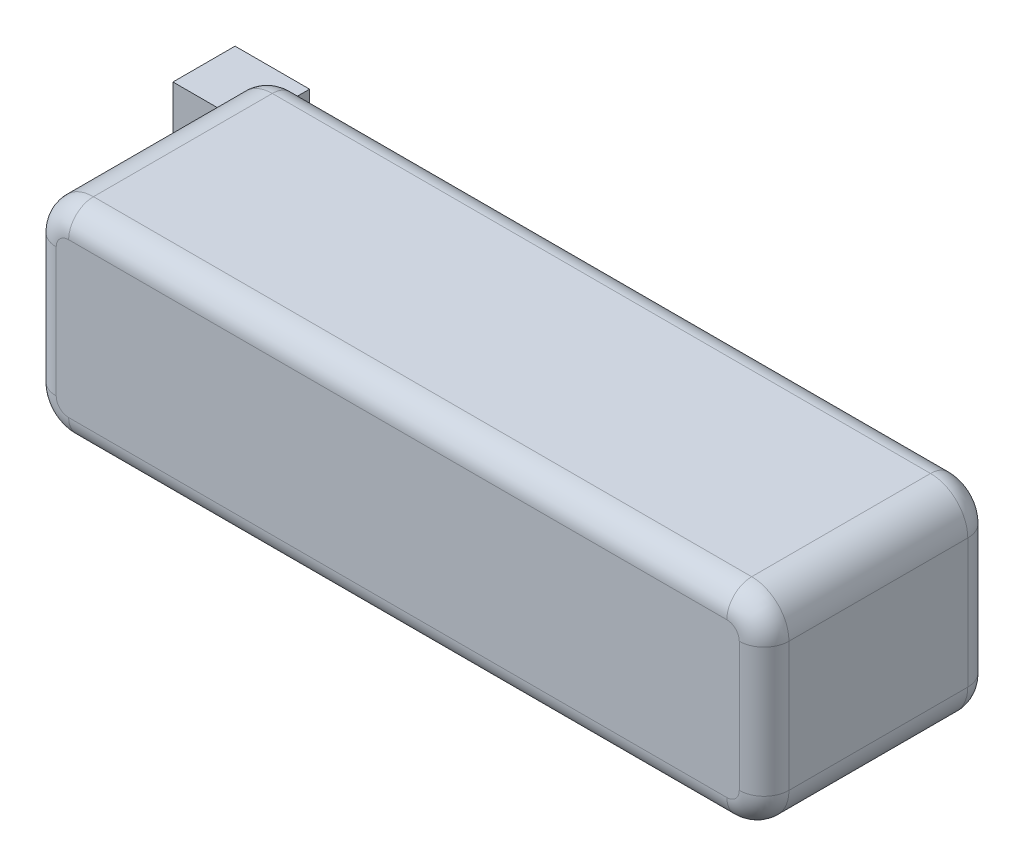
ISO-10303-21;
HEADER;
FILE_DESCRIPTION(('STEP AP214'),'2;1');
FILE_NAME('part.step','',(''),(''),'','','');
FILE_SCHEMA(('AUTOMOTIVE_DESIGN { 1 0 10303 214 1 1 1 1 }'));
ENDSEC;
DATA;
#1=APPLICATION_CONTEXT('core data for automotive mechanical design processes');
#2=APPLICATION_PROTOCOL_DEFINITION('international standard','automotive_design',2000,#1);
#3=PRODUCT_CONTEXT('',#1,'mechanical');
#4=PRODUCT('Part','Part','',(#3));
#5=PRODUCT_RELATED_PRODUCT_CATEGORY('part','',(#4));
#6=PRODUCT_DEFINITION_FORMATION('','',#4);
#7=PRODUCT_DEFINITION_CONTEXT('part definition',#1,'design');
#8=PRODUCT_DEFINITION('design','',#6,#7);
#9=PRODUCT_DEFINITION_SHAPE('','',#8);
#10=(LENGTH_UNIT() NAMED_UNIT(*) SI_UNIT(.MILLI.,.METRE.));
#11=(NAMED_UNIT(*) PLANE_ANGLE_UNIT() SI_UNIT($,.RADIAN.));
#12=(NAMED_UNIT(*) SI_UNIT($,.STERADIAN.) SOLID_ANGLE_UNIT());
#13=UNCERTAINTY_MEASURE_WITH_UNIT(LENGTH_MEASURE(1.E-05),#10,'distance_accuracy_value','');
#14=(GEOMETRIC_REPRESENTATION_CONTEXT(3) GLOBAL_UNCERTAINTY_ASSIGNED_CONTEXT((#13)) GLOBAL_UNIT_ASSIGNED_CONTEXT((#10,
#11,#12)) REPRESENTATION_CONTEXT('',''));
#15=CARTESIAN_POINT('',(0.,0.,0.));
#16=DIRECTION('',(0.,0.,1.));
#17=DIRECTION('',(1.,0.,0.));
#18=AXIS2_PLACEMENT_3D('',#15,#16,#17);
#19=CARTESIAN_POINT('',(0.,20.828,0.));
#20=DIRECTION('',(1.,0.,0.));
#21=DIRECTION('',(0.,0.,-1.));
#22=AXIS2_PLACEMENT_3D('',#19,#20,#21);
#23=PLANE('',#22);
#24=DIRECTION('',(0.,0.,1.));
#25=VECTOR('',#24,1.);
#26=CARTESIAN_POINT('',(0.,17.018,0.));
#27=LINE('',#26,#25);
#28=CARTESIAN_POINT('',(0.,17.018,20.828));
#29=VERTEX_POINT('',#28);
#30=CARTESIAN_POINT('',(0.,17.018,2.54));
#31=VERTEX_POINT('',#30);
#32=EDGE_CURVE('E266',#29,#31,#27,.F.);
#33=ORIENTED_EDGE('',*,*,#32,.T.);
#34=DIRECTION('',(0.,-1.,0.));
#35=VECTOR('',#34,1.);
#36=CARTESIAN_POINT('',(0.,20.828,2.54));
#37=LINE('',#36,#35);
#38=CARTESIAN_POINT('',(0.,15.494,2.54));
#39=VERTEX_POINT('',#38);
#40=EDGE_CURVE('E340',#31,#39,#37,.T.);
#41=ORIENTED_EDGE('',*,*,#40,.T.);
#42=DIRECTION('',(0.,0.,-1.));
#43=VECTOR('',#42,1.);
#44=CARTESIAN_POINT('',(0.,15.494,0.));
#45=LINE('',#44,#43);
#46=CARTESIAN_POINT('',(0.,15.494,3.81));
#47=VERTEX_POINT('',#46);
#48=EDGE_CURVE('E806',#47,#39,#45,.T.);
#49=ORIENTED_EDGE('',*,*,#48,.F.);
#50=DIRECTION('',(0.,-1.,0.));
#51=VECTOR('',#50,1.);
#52=CARTESIAN_POINT('',(0.,20.828,3.81));
#53=LINE('',#52,#51);
#54=CARTESIAN_POINT('',(0.,5.334,3.81));
#55=VERTEX_POINT('',#54);
#56=EDGE_CURVE('E233',#47,#55,#53,.T.);
#57=ORIENTED_EDGE('',*,*,#56,.T.);
#58=DIRECTION('',(0.,0.,-1.));
#59=VECTOR('',#58,1.);
#60=CARTESIAN_POINT('',(0.,5.334,0.));
#61=LINE('',#60,#59);
#62=CARTESIAN_POINT('',(0.,5.334,2.54));
#63=VERTEX_POINT('',#62);
#64=EDGE_CURVE('E226',#55,#63,#61,.T.);
#65=ORIENTED_EDGE('',*,*,#64,.T.);
#66=DIRECTION('',(0.,-1.,0.));
#67=VECTOR('',#66,1.);
#68=CARTESIAN_POINT('',(0.,20.828,2.54));
#69=LINE('',#68,#67);
#70=CARTESIAN_POINT('',(0.,3.81,2.54));
#71=VERTEX_POINT('',#70);
#72=EDGE_CURVE('E315',#63,#71,#69,.T.);
#73=ORIENTED_EDGE('',*,*,#72,.T.);
#74=DIRECTION('',(0.,0.,1.));
#75=VECTOR('',#74,1.);
#76=CARTESIAN_POINT('',(0.,3.81,0.));
#77=LINE('',#76,#75);
#78=CARTESIAN_POINT('',(0.,3.81,20.828));
#79=VERTEX_POINT('',#78);
#80=EDGE_CURVE('E264',#71,#79,#77,.T.);
#81=ORIENTED_EDGE('',*,*,#80,.T.);
#82=DIRECTION('',(0.,-1.,0.));
#83=VECTOR('',#82,1.);
#84=CARTESIAN_POINT('',(0.,20.828,20.828));
#85=LINE('',#84,#83);
#86=EDGE_CURVE('E298',#79,#29,#85,.F.);
#87=ORIENTED_EDGE('',*,*,#86,.T.);
#88=EDGE_LOOP('',(#33,#41,#49,#57,#65,#73,#81,#87));
#89=FACE_BOUND('',#88,.T.);
#90=ADVANCED_FACE('F41',(#89),#23,.F.);
#91=CARTESIAN_POINT('',(0.,20.828,23.368));
#92=DIRECTION('',(0.,0.,-1.));
#93=DIRECTION('',(-1.,0.,0.));
#94=AXIS2_PLACEMENT_3D('',#91,#92,#93);
#95=PLANE('',#94);
#96=DIRECTION('',(0.,-1.,0.));
#97=VECTOR('',#96,1.);
#98=CARTESIAN_POINT('',(2.54000000000001,20.828,23.368));
#99=LINE('',#98,#97);
#100=CARTESIAN_POINT('',(2.54000000000001,17.018,23.368));
#101=VERTEX_POINT('',#100);
#102=CARTESIAN_POINT('',(2.54000000000001,3.81,23.368));
#103=VERTEX_POINT('',#102);
#104=EDGE_CURVE('E290',#101,#103,#99,.T.);
#105=ORIENTED_EDGE('',*,*,#104,.T.);
#106=CARTESIAN_POINT('',(3.81000000000001,3.81,23.368));
#107=DIRECTION('',(0.,0.,-1.));
#108=DIRECTION('',(-1.,0.,0.));
#109=AXIS2_PLACEMENT_3D('',#106,#107,#108);
#110=CIRCLE('',#109,1.27);
#111=CARTESIAN_POINT('',(3.81000000000001,2.54,23.368));
#112=VERTEX_POINT('',#111);
#113=EDGE_CURVE('E292',#103,#112,#110,.F.);
#114=ORIENTED_EDGE('',*,*,#113,.T.);
#115=DIRECTION('',(1.,0.,0.));
#116=VECTOR('',#115,1.);
#117=CARTESIAN_POINT('',(0.,2.54,23.368));
#118=LINE('',#117,#116);
#119=CARTESIAN_POINT('',(71.12,2.54,23.368));
#120=VERTEX_POINT('',#119);
#121=EDGE_CURVE('E278',#112,#120,#118,.T.);
#122=ORIENTED_EDGE('',*,*,#121,.T.);
#123=CARTESIAN_POINT('',(71.12,3.81,23.368));
#124=DIRECTION('',(0.,0.,-1.));
#125=DIRECTION('',(-1.,0.,0.));
#126=AXIS2_PLACEMENT_3D('',#123,#124,#125);
#127=CIRCLE('',#126,1.27);
#128=CARTESIAN_POINT('',(72.39,3.81,23.368));
#129=VERTEX_POINT('',#128);
#130=EDGE_CURVE('E280',#120,#129,#127,.F.);
#131=ORIENTED_EDGE('',*,*,#130,.T.);
#132=DIRECTION('',(0.,-1.,0.));
#133=VECTOR('',#132,1.);
#134=CARTESIAN_POINT('',(72.39,20.828,23.368));
#135=LINE('',#134,#133);
#136=CARTESIAN_POINT('',(72.39,17.018,23.368));
#137=VERTEX_POINT('',#136);
#138=EDGE_CURVE('E282',#129,#137,#135,.F.);
#139=ORIENTED_EDGE('',*,*,#138,.T.);
#140=CARTESIAN_POINT('',(71.12,17.018,23.368));
#141=DIRECTION('',(0.,0.,-1.));
#142=DIRECTION('',(-1.,0.,0.));
#143=AXIS2_PLACEMENT_3D('',#140,#141,#142);
#144=CIRCLE('',#143,1.27);
#145=CARTESIAN_POINT('',(71.12,18.288,23.368));
#146=VERTEX_POINT('',#145);
#147=EDGE_CURVE('E284',#137,#146,#144,.F.);
#148=ORIENTED_EDGE('',*,*,#147,.T.);
#149=DIRECTION('',(1.,0.,0.));
#150=VECTOR('',#149,1.);
#151=CARTESIAN_POINT('',(3.81000000000001,18.288,23.368));
#152=LINE('',#151,#150);
#153=CARTESIAN_POINT('',(3.81000000000001,18.288,23.368));
#154=VERTEX_POINT('',#153);
#155=EDGE_CURVE('E286',#146,#154,#152,.F.);
#156=ORIENTED_EDGE('',*,*,#155,.T.);
#157=CARTESIAN_POINT('',(3.81000000000001,17.018,23.368));
#158=DIRECTION('',(0.,0.,-1.));
#159=DIRECTION('',(-1.,0.,0.));
#160=AXIS2_PLACEMENT_3D('',#157,#158,#159);
#161=CIRCLE('',#160,1.27);
#162=EDGE_CURVE('E288',#154,#101,#161,.F.);
#163=ORIENTED_EDGE('',*,*,#162,.T.);
#164=EDGE_LOOP('',(#105,#114,#122,#131,#139,#148,#156,#163));
#165=FACE_BOUND('',#164,.T.);
#166=ADVANCED_FACE('F456',(#165),#95,.F.);
#167=CARTESIAN_POINT('',(74.93,20.828,0.));
#168=DIRECTION('',(-1.,0.,0.));
#169=DIRECTION('',(0.,0.,1.));
#170=AXIS2_PLACEMENT_3D('',#167,#168,#169);
#171=PLANE('',#170);
#172=DIRECTION('',(0.,0.,-1.));
#173=VECTOR('',#172,1.);
#174=CARTESIAN_POINT('',(74.93,3.81,0.));
#175=LINE('',#174,#173);
#176=CARTESIAN_POINT('',(74.93,3.81,20.828));
#177=VERTEX_POINT('',#176);
#178=CARTESIAN_POINT('',(74.93,3.81,2.54));
#179=VERTEX_POINT('',#178);
#180=EDGE_CURVE('E269',#177,#179,#175,.T.);
#181=ORIENTED_EDGE('',*,*,#180,.T.);
#182=DIRECTION('',(0.,-1.,0.));
#183=VECTOR('',#182,1.);
#184=CARTESIAN_POINT('',(74.93,20.828,2.54));
#185=LINE('',#184,#183);
#186=CARTESIAN_POINT('',(74.93,17.018,2.54));
#187=VERTEX_POINT('',#186);
#188=EDGE_CURVE('E367',#179,#187,#185,.F.);
#189=ORIENTED_EDGE('',*,*,#188,.T.);
#190=DIRECTION('',(0.,0.,-1.));
#191=VECTOR('',#190,1.);
#192=CARTESIAN_POINT('',(74.93,17.018,23.368));
#193=LINE('',#192,#191);
#194=CARTESIAN_POINT('',(74.93,17.018,20.828));
#195=VERTEX_POINT('',#194);
#196=EDGE_CURVE('E272',#187,#195,#193,.F.);
#197=ORIENTED_EDGE('',*,*,#196,.T.);
#198=DIRECTION('',(0.,-1.,0.));
#199=VECTOR('',#198,1.);
#200=CARTESIAN_POINT('',(74.93,20.828,20.828));
#201=LINE('',#200,#199);
#202=EDGE_CURVE('E308',#195,#177,#201,.T.);
#203=ORIENTED_EDGE('',*,*,#202,.T.);
#204=EDGE_LOOP('',(#181,#189,#197,#203));
#205=FACE_BOUND('',#204,.T.);
#206=ADVANCED_FACE('F462',(#205),#171,.F.);
#207=CARTESIAN_POINT('',(0.,20.828,0.));
#208=DIRECTION('',(0.,0.,1.));
#209=DIRECTION('',(1.,0.,0.));
#210=AXIS2_PLACEMENT_3D('',#207,#208,#209);
#211=PLANE('',#210);
#212=DIRECTION('',(0.,-1.,0.));
#213=VECTOR('',#212,1.);
#214=CARTESIAN_POINT('',(2.54,15.494,0.));
#215=LINE('',#214,#213);
#216=CARTESIAN_POINT('',(2.54,5.334,0.));
#217=VERTEX_POINT('',#216);
#218=CARTESIAN_POINT('',(2.54,15.494,0.));
#219=VERTEX_POINT('',#218);
#220=EDGE_CURVE('E246',#217,#219,#215,.F.);
#221=ORIENTED_EDGE('',*,*,#220,.T.);
#222=DIRECTION('',(0.,-1.,0.));
#223=VECTOR('',#222,1.);
#224=CARTESIAN_POINT('',(2.54,20.828,0.));
#225=LINE('',#224,#223);
#226=CARTESIAN_POINT('',(2.54,17.018,0.));
#227=VERTEX_POINT('',#226);
#228=EDGE_CURVE('E359',#219,#227,#225,.F.);
#229=ORIENTED_EDGE('',*,*,#228,.T.);
#230=CARTESIAN_POINT('',(3.81,17.018,0.));
#231=DIRECTION('',(0.,0.,1.));
#232=DIRECTION('',(1.,0.,0.));
#233=AXIS2_PLACEMENT_3D('',#230,#231,#232);
#234=CIRCLE('',#233,1.27);
#235=CARTESIAN_POINT('',(3.81,18.288,0.));
#236=VERTEX_POINT('',#235);
#237=EDGE_CURVE('E357',#227,#236,#234,.F.);
#238=ORIENTED_EDGE('',*,*,#237,.T.);
#239=DIRECTION('',(-1.,0.,0.));
#240=VECTOR('',#239,1.);
#241=CARTESIAN_POINT('',(71.12,18.288,0.));
#242=LINE('',#241,#240);
#243=CARTESIAN_POINT('',(71.12,18.288,0.));
#244=VERTEX_POINT('',#243);
#245=EDGE_CURVE('E355',#236,#244,#242,.F.);
#246=ORIENTED_EDGE('',*,*,#245,.T.);
#247=CARTESIAN_POINT('',(71.12,17.018,0.));
#248=DIRECTION('',(0.,0.,1.));
#249=DIRECTION('',(1.,0.,0.));
#250=AXIS2_PLACEMENT_3D('',#247,#248,#249);
#251=CIRCLE('',#250,1.27);
#252=CARTESIAN_POINT('',(72.39,17.018,0.));
#253=VERTEX_POINT('',#252);
#254=EDGE_CURVE('E353',#244,#253,#251,.F.);
#255=ORIENTED_EDGE('',*,*,#254,.T.);
#256=DIRECTION('',(0.,-1.,0.));
#257=VECTOR('',#256,1.);
#258=CARTESIAN_POINT('',(72.39,20.828,0.));
#259=LINE('',#258,#257);
#260=CARTESIAN_POINT('',(72.39,3.81,0.));
#261=VERTEX_POINT('',#260);
#262=EDGE_CURVE('E351',#253,#261,#259,.T.);
#263=ORIENTED_EDGE('',*,*,#262,.T.);
#264=CARTESIAN_POINT('',(71.12,3.81,0.));
#265=DIRECTION('',(0.,0.,1.));
#266=DIRECTION('',(1.,0.,0.));
#267=AXIS2_PLACEMENT_3D('',#264,#265,#266);
#268=CIRCLE('',#267,1.27);
#269=CARTESIAN_POINT('',(71.12,2.54,0.));
#270=VERTEX_POINT('',#269);
#271=EDGE_CURVE('E349',#261,#270,#268,.F.);
#272=ORIENTED_EDGE('',*,*,#271,.T.);
#273=DIRECTION('',(-1.,0.,0.));
#274=VECTOR('',#273,1.);
#275=CARTESIAN_POINT('',(0.,2.54,0.));
#276=LINE('',#275,#274);
#277=CARTESIAN_POINT('',(3.81,2.54,0.));
#278=VERTEX_POINT('',#277);
#279=EDGE_CURVE('E343',#270,#278,#276,.T.);
#280=ORIENTED_EDGE('',*,*,#279,.T.);
#281=CARTESIAN_POINT('',(3.81,3.81,0.));
#282=DIRECTION('',(0.,0.,1.));
#283=DIRECTION('',(1.,0.,0.));
#284=AXIS2_PLACEMENT_3D('',#281,#282,#283);
#285=CIRCLE('',#284,1.27);
#286=CARTESIAN_POINT('',(2.54,3.81,0.));
#287=VERTEX_POINT('',#286);
#288=EDGE_CURVE('E345',#278,#287,#285,.F.);
#289=ORIENTED_EDGE('',*,*,#288,.T.);
#290=DIRECTION('',(0.,-1.,0.));
#291=VECTOR('',#290,1.);
#292=CARTESIAN_POINT('',(2.54,20.828,0.));
#293=LINE('',#292,#291);
#294=EDGE_CURVE('E347',#287,#217,#293,.F.);
#295=ORIENTED_EDGE('',*,*,#294,.T.);
#296=EDGE_LOOP('',(#221,#229,#238,#246,#255,#263,#272,#280,#289,#295));
#297=FACE_BOUND('',#296,.T.);
#298=ADVANCED_FACE('F406',(#297),#211,.F.);
#299=CARTESIAN_POINT('',(0.,20.828,23.368));
#300=DIRECTION('',(0.,1.,0.));
#301=DIRECTION('',(0.,0.,1.));
#302=AXIS2_PLACEMENT_3D('',#299,#300,#301);
#303=PLANE('',#302);
#304=DIRECTION('',(0.,0.,-1.));
#305=VECTOR('',#304,1.);
#306=CARTESIAN_POINT('',(71.12,20.828,0.));
#307=LINE('',#306,#305);
#308=CARTESIAN_POINT('',(71.12,20.828,20.828));
#309=VERTEX_POINT('',#308);
#310=CARTESIAN_POINT('',(71.12,20.828,2.54));
#311=VERTEX_POINT('',#310);
#312=EDGE_CURVE('E259',#309,#311,#307,.T.);
#313=ORIENTED_EDGE('',*,*,#312,.T.);
#314=DIRECTION('',(-1.,0.,0.));
#315=VECTOR('',#314,1.);
#316=CARTESIAN_POINT('',(3.81,20.828,2.54));
#317=LINE('',#316,#315);
#318=CARTESIAN_POINT('',(3.81,20.828,2.54));
#319=VERTEX_POINT('',#318);
#320=EDGE_CURVE('E363',#311,#319,#317,.T.);
#321=ORIENTED_EDGE('',*,*,#320,.T.);
#322=DIRECTION('',(0.,0.,1.));
#323=VECTOR('',#322,1.);
#324=CARTESIAN_POINT('',(3.81000000000001,20.828,23.368));
#325=LINE('',#324,#323);
#326=CARTESIAN_POINT('',(3.81000000000001,20.828,20.828));
#327=VERTEX_POINT('',#326);
#328=EDGE_CURVE('E262',#319,#327,#325,.T.);
#329=ORIENTED_EDGE('',*,*,#328,.T.);
#330=DIRECTION('',(1.,0.,0.));
#331=VECTOR('',#330,1.);
#332=CARTESIAN_POINT('',(71.12,20.828,20.828));
#333=LINE('',#332,#331);
#334=EDGE_CURVE('E303',#327,#309,#333,.T.);
#335=ORIENTED_EDGE('',*,*,#334,.T.);
#336=EDGE_LOOP('',(#313,#321,#329,#335));
#337=FACE_BOUND('',#336,.T.);
#338=ADVANCED_FACE('F726',(#337),#303,.T.);
#339=CARTESIAN_POINT('',(0.,0.,23.368));
#340=DIRECTION('',(0.,1.,0.));
#341=DIRECTION('',(0.,0.,1.));
#342=AXIS2_PLACEMENT_3D('',#339,#340,#341);
#343=PLANE('',#342);
#344=DIRECTION('',(0.,0.,1.));
#345=VECTOR('',#344,1.);
#346=CARTESIAN_POINT('',(3.81000000000001,0.,23.368));
#347=LINE('',#346,#345);
#348=CARTESIAN_POINT('',(3.81000000000001,0.,20.828));
#349=VERTEX_POINT('',#348);
#350=CARTESIAN_POINT('',(3.81,0.,2.54));
#351=VERTEX_POINT('',#350);
#352=EDGE_CURVE('E274',#349,#351,#347,.F.);
#353=ORIENTED_EDGE('',*,*,#352,.T.);
#354=DIRECTION('',(-1.,0.,0.));
#355=VECTOR('',#354,1.);
#356=CARTESIAN_POINT('',(0.,0.,2.54));
#357=LINE('',#356,#355);
#358=CARTESIAN_POINT('',(71.12,0.,2.54));
#359=VERTEX_POINT('',#358);
#360=EDGE_CURVE('E65',#351,#359,#357,.F.);
#361=ORIENTED_EDGE('',*,*,#360,.T.);
#362=DIRECTION('',(0.,0.,-1.));
#363=VECTOR('',#362,1.);
#364=CARTESIAN_POINT('',(71.12,0.,23.368));
#365=LINE('',#364,#363);
#366=CARTESIAN_POINT('',(71.12,0.,20.828));
#367=VERTEX_POINT('',#366);
#368=EDGE_CURVE('E276',#359,#367,#365,.F.);
#369=ORIENTED_EDGE('',*,*,#368,.T.);
#370=DIRECTION('',(1.,0.,0.));
#371=VECTOR('',#370,1.);
#372=CARTESIAN_POINT('',(0.,0.,20.828));
#373=LINE('',#372,#371);
#374=EDGE_CURVE('E313',#367,#349,#373,.F.);
#375=ORIENTED_EDGE('',*,*,#374,.T.);
#376=EDGE_LOOP('',(#353,#361,#369,#375));
#377=FACE_BOUND('',#376,.T.);
#378=ADVANCED_FACE('F692',(#377),#343,.F.);
#379=CARTESIAN_POINT('',(0.,0.,0.));
#380=DIRECTION('',(-1.,0.,0.));
#381=DIRECTION('',(0.,0.,1.));
#382=AXIS2_PLACEMENT_3D('',#379,#380,#381);
#383=PLANE('',#382);
#384=CARTESIAN_POINT('',(0.,15.494,-2.54));
#385=VERTEX_POINT('',#384);
#386=CARTESIAN_POINT('',(0.,15.494,-5.08));
#387=VERTEX_POINT('',#386);
#388=EDGE_CURVE('E231',#385,#387,#45,.T.);
#389=ORIENTED_EDGE('',*,*,#388,.F.);
#390=DIRECTION('',(0.,-1.,0.));
#391=VECTOR('',#390,1.);
#392=CARTESIAN_POINT('',(0.,5.334,-2.54));
#393=LINE('',#392,#391);
#394=CARTESIAN_POINT('',(0.,5.334,-2.54));
#395=VERTEX_POINT('',#394);
#396=EDGE_CURVE('E243',#385,#395,#393,.T.);
#397=ORIENTED_EDGE('',*,*,#396,.T.);
#398=CARTESIAN_POINT('',(0.,5.334,-5.08));
#399=VERTEX_POINT('',#398);
#400=EDGE_CURVE('E413',#395,#399,#61,.T.);
#401=ORIENTED_EDGE('',*,*,#400,.T.);
#402=DIRECTION('',(0.,-1.,0.));
#403=VECTOR('',#402,1.);
#404=CARTESIAN_POINT('',(0.,0.,-5.08));
#405=LINE('',#404,#403);
#406=EDGE_CURVE('E798',#387,#399,#405,.T.);
#407=ORIENTED_EDGE('',*,*,#406,.F.);
#408=EDGE_LOOP('',(#389,#397,#401,#407));
#409=FACE_BOUND('',#408,.T.);
#410=ADVANCED_FACE('F688',(#409),#383,.F.);
#411=CARTESIAN_POINT('',(-7.62,15.494,0.));
#412=DIRECTION('',(0.,-1.,0.));
#413=DIRECTION('',(0.,0.,-1.));
#414=AXIS2_PLACEMENT_3D('',#411,#412,#413);
#415=PLANE('',#414);
#416=ORIENTED_EDGE('',*,*,#48,.T.);
#417=CARTESIAN_POINT('',(2.54,15.494,2.54));
#418=DIRECTION('',(0.,-1.,0.));
#419=DIRECTION('',(0.,0.,-1.));
#420=AXIS2_PLACEMENT_3D('',#417,#418,#419);
#421=CIRCLE('',#420,2.54);
#422=EDGE_CURVE('E50',#39,#219,#421,.T.);
#423=ORIENTED_EDGE('',*,*,#422,.T.);
#424=CARTESIAN_POINT('',(2.54,15.494,-2.54));
#425=DIRECTION('',(0.,-1.,0.));
#426=DIRECTION('',(0.,0.,-1.));
#427=AXIS2_PLACEMENT_3D('',#424,#425,#426);
#428=CIRCLE('',#427,2.54);
#429=EDGE_CURVE('E257',#219,#385,#428,.T.);
#430=ORIENTED_EDGE('',*,*,#429,.T.);
#431=ORIENTED_EDGE('',*,*,#388,.T.);
#432=DIRECTION('',(1.,0.,0.));
#433=VECTOR('',#432,1.);
#434=CARTESIAN_POINT('',(-7.62,15.494,-5.08));
#435=LINE('',#434,#433);
#436=CARTESIAN_POINT('',(-7.62,15.494,-5.08));
#437=VERTEX_POINT('',#436);
#438=EDGE_CURVE('E210',#437,#387,#435,.T.);
#439=ORIENTED_EDGE('',*,*,#438,.F.);
#440=DIRECTION('',(0.,0.,-1.));
#441=VECTOR('',#440,1.);
#442=CARTESIAN_POINT('',(-7.62,15.494,0.));
#443=LINE('',#442,#441);
#444=CARTESIAN_POINT('',(-7.62,15.494,1.27));
#445=VERTEX_POINT('',#444);
#446=EDGE_CURVE('E217',#445,#437,#443,.T.);
#447=ORIENTED_EDGE('',*,*,#446,.F.);
#448=DIRECTION('',(1.,0.,0.));
#449=VECTOR('',#448,1.);
#450=CARTESIAN_POINT('',(-7.62,15.494,1.27));
#451=LINE('',#450,#449);
#452=CARTESIAN_POINT('',(-2.54,15.494,1.27));
#453=VERTEX_POINT('',#452);
#454=EDGE_CURVE('E802',#445,#453,#451,.T.);
#455=ORIENTED_EDGE('',*,*,#454,.T.);
#456=CARTESIAN_POINT('',(-2.54,15.494,3.81));
#457=DIRECTION('',(0.,-1.,0.));
#458=DIRECTION('',(0.,0.,-1.));
#459=AXIS2_PLACEMENT_3D('',#456,#457,#458);
#460=CIRCLE('',#459,2.54);
#461=EDGE_CURVE('E251',#453,#47,#460,.T.);
#462=ORIENTED_EDGE('',*,*,#461,.T.);
#463=EDGE_LOOP('',(#416,#423,#430,#431,#439,#447,#455,#462));
#464=FACE_BOUND('',#463,.T.);
#465=ADVANCED_FACE('F229',(#464),#415,.F.);
#466=CARTESIAN_POINT('',(-7.62,0.,-5.07999999999999));
#467=DIRECTION('',(0.,0.,1.));
#468=DIRECTION('',(1.,0.,0.));
#469=AXIS2_PLACEMENT_3D('',#466,#467,#468);
#470=PLANE('',#469);
#471=ORIENTED_EDGE('',*,*,#406,.T.);
#472=DIRECTION('',(1.,0.,0.));
#473=VECTOR('',#472,1.);
#474=CARTESIAN_POINT('',(-7.62,5.334,-5.07999999999999));
#475=LINE('',#474,#473);
#476=CARTESIAN_POINT('',(-7.62,5.334,-5.07999999999999));
#477=VERTEX_POINT('',#476);
#478=EDGE_CURVE('E212',#477,#399,#475,.T.);
#479=ORIENTED_EDGE('',*,*,#478,.F.);
#480=DIRECTION('',(0.,-1.,0.));
#481=VECTOR('',#480,1.);
#482=CARTESIAN_POINT('',(-7.62,0.,-5.07999999999999));
#483=LINE('',#482,#481);
#484=EDGE_CURVE('E205',#437,#477,#483,.T.);
#485=ORIENTED_EDGE('',*,*,#484,.F.);
#486=ORIENTED_EDGE('',*,*,#438,.T.);
#487=EDGE_LOOP('',(#471,#479,#485,#486));
#488=FACE_BOUND('',#487,.T.);
#489=ADVANCED_FACE('F208',(#488),#470,.F.);
#490=CARTESIAN_POINT('',(-7.62,5.334,0.));
#491=DIRECTION('',(0.,-1.,0.));
#492=DIRECTION('',(0.,0.,-1.));
#493=AXIS2_PLACEMENT_3D('',#490,#491,#492);
#494=PLANE('',#493);
#495=ORIENTED_EDGE('',*,*,#64,.F.);
#496=CARTESIAN_POINT('',(-2.54,5.334,3.81));
#497=DIRECTION('',(0.,-1.,0.));
#498=DIRECTION('',(0.,0.,-1.));
#499=AXIS2_PLACEMENT_3D('',#496,#497,#498);
#500=CIRCLE('',#499,2.54);
#501=CARTESIAN_POINT('',(-2.54,5.334,1.27));
#502=VERTEX_POINT('',#501);
#503=EDGE_CURVE('E249',#55,#502,#500,.F.);
#504=ORIENTED_EDGE('',*,*,#503,.T.);
#505=DIRECTION('',(1.,0.,0.));
#506=VECTOR('',#505,1.);
#507=CARTESIAN_POINT('',(-7.62,5.334,1.27000000000001));
#508=LINE('',#507,#506);
#509=CARTESIAN_POINT('',(-7.62,5.334,1.27000000000001));
#510=VERTEX_POINT('',#509);
#511=EDGE_CURVE('E238',#510,#502,#508,.T.);
#512=ORIENTED_EDGE('',*,*,#511,.F.);
#513=DIRECTION('',(0.,0.,-1.));
#514=VECTOR('',#513,1.);
#515=CARTESIAN_POINT('',(-7.62,5.334,0.));
#516=LINE('',#515,#514);
#517=EDGE_CURVE('E216',#510,#477,#516,.T.);
#518=ORIENTED_EDGE('',*,*,#517,.T.);
#519=ORIENTED_EDGE('',*,*,#478,.T.);
#520=ORIENTED_EDGE('',*,*,#400,.F.);
#521=CARTESIAN_POINT('',(2.54,5.334,-2.54));
#522=DIRECTION('',(0.,-1.,0.));
#523=DIRECTION('',(0.,0.,-1.));
#524=AXIS2_PLACEMENT_3D('',#521,#522,#523);
#525=CIRCLE('',#524,2.54);
#526=EDGE_CURVE('E254',#395,#217,#525,.F.);
#527=ORIENTED_EDGE('',*,*,#526,.T.);
#528=CARTESIAN_POINT('',(2.54,5.334,2.54));
#529=DIRECTION('',(0.,-1.,0.));
#530=DIRECTION('',(0.,0.,-1.));
#531=AXIS2_PLACEMENT_3D('',#528,#529,#530);
#532=CIRCLE('',#531,2.54);
#533=EDGE_CURVE('E11',#217,#63,#532,.F.);
#534=ORIENTED_EDGE('',*,*,#533,.T.);
#535=EDGE_LOOP('',(#495,#504,#512,#518,#519,#520,#527,#534));
#536=FACE_BOUND('',#535,.T.);
#537=ADVANCED_FACE('F411',(#536),#494,.T.);
#538=CARTESIAN_POINT('',(-7.62,0.,1.27000000000001));
#539=DIRECTION('',(0.,0.,1.));
#540=DIRECTION('',(1.,0.,0.));
#541=AXIS2_PLACEMENT_3D('',#538,#539,#540);
#542=PLANE('',#541);
#543=ORIENTED_EDGE('',*,*,#511,.T.);
#544=DIRECTION('',(0.,-1.,0.));
#545=VECTOR('',#544,1.);
#546=CARTESIAN_POINT('',(-2.54,0.,1.27));
#547=LINE('',#546,#545);
#548=EDGE_CURVE('E236',#502,#453,#547,.F.);
#549=ORIENTED_EDGE('',*,*,#548,.T.);
#550=ORIENTED_EDGE('',*,*,#454,.F.);
#551=DIRECTION('',(0.,-1.,0.));
#552=VECTOR('',#551,1.);
#553=CARTESIAN_POINT('',(-7.62,0.,1.27000000000001));
#554=LINE('',#553,#552);
#555=EDGE_CURVE('E223',#445,#510,#554,.T.);
#556=ORIENTED_EDGE('',*,*,#555,.T.);
#557=EDGE_LOOP('',(#543,#549,#550,#556));
#558=FACE_BOUND('',#557,.T.);
#559=ADVANCED_FACE('F675',(#558),#542,.T.);
#560=CARTESIAN_POINT('',(-7.62,0.,0.));
#561=DIRECTION('',(-1.,0.,0.));
#562=DIRECTION('',(0.,0.,1.));
#563=AXIS2_PLACEMENT_3D('',#560,#561,#562);
#564=PLANE('',#563);
#565=ORIENTED_EDGE('',*,*,#446,.T.);
#566=ORIENTED_EDGE('',*,*,#484,.T.);
#567=ORIENTED_EDGE('',*,*,#517,.F.);
#568=ORIENTED_EDGE('',*,*,#555,.F.);
#569=EDGE_LOOP('',(#565,#566,#567,#568));
#570=FACE_BOUND('',#569,.T.);
#571=ADVANCED_FACE('F221',(#570),#564,.T.);
#572=CARTESIAN_POINT('',(-2.54,20.828,3.81));
#573=DIRECTION('',(0.,-1.,0.));
#574=DIRECTION('',(0.,0.,-1.));
#575=AXIS2_PLACEMENT_3D('',#572,#573,#574);
#576=CYLINDRICAL_SURFACE('',#575,2.54);
#577=ORIENTED_EDGE('',*,*,#461,.F.);
#578=ORIENTED_EDGE('',*,*,#548,.F.);
#579=ORIENTED_EDGE('',*,*,#503,.F.);
#580=ORIENTED_EDGE('',*,*,#56,.F.);
#581=EDGE_LOOP('',(#577,#578,#579,#580));
#582=FACE_BOUND('',#581,.T.);
#583=ADVANCED_FACE('F467',(#582),#576,.F.);
#584=CARTESIAN_POINT('',(2.54,0.,-2.54));
#585=DIRECTION('',(0.,1.,0.));
#586=DIRECTION('',(0.,0.,1.));
#587=AXIS2_PLACEMENT_3D('',#584,#585,#586);
#588=CYLINDRICAL_SURFACE('',#587,2.54);
#589=ORIENTED_EDGE('',*,*,#429,.F.);
#590=ORIENTED_EDGE('',*,*,#220,.F.);
#591=ORIENTED_EDGE('',*,*,#526,.F.);
#592=ORIENTED_EDGE('',*,*,#396,.F.);
#593=EDGE_LOOP('',(#589,#590,#591,#592));
#594=FACE_BOUND('',#593,.T.);
#595=ADVANCED_FACE('F416',(#594),#588,.F.);
#596=CARTESIAN_POINT('',(3.81000000000001,17.018,23.368));
#597=DIRECTION('',(0.,0.,-1.));
#598=DIRECTION('',(-1.,0.,0.));
#599=AXIS2_PLACEMENT_3D('',#596,#597,#598);
#600=CYLINDRICAL_SURFACE('',#599,3.81);
#601=ORIENTED_EDGE('',*,*,#328,.F.);
#602=CARTESIAN_POINT('',(3.81,17.018,2.54));
#603=DIRECTION('',(0.,0.,1.));
#604=DIRECTION('',(1.,0.,0.));
#605=AXIS2_PLACEMENT_3D('',#602,#603,#604);
#606=CIRCLE('',#605,3.81);
#607=EDGE_CURVE('E361',#319,#31,#606,.T.);
#608=ORIENTED_EDGE('',*,*,#607,.T.);
#609=ORIENTED_EDGE('',*,*,#32,.F.);
#610=CARTESIAN_POINT('',(3.81000000000001,17.018,20.828));
#611=DIRECTION('',(0.,0.,-1.));
#612=DIRECTION('',(-1.,0.,0.));
#613=AXIS2_PLACEMENT_3D('',#610,#611,#612);
#614=CIRCLE('',#613,3.81);
#615=EDGE_CURVE('E300',#29,#327,#614,.T.);
#616=ORIENTED_EDGE('',*,*,#615,.T.);
#617=EDGE_LOOP('',(#601,#608,#609,#616));
#618=FACE_BOUND('',#617,.T.);
#619=ADVANCED_FACE('F473',(#618),#600,.T.);
#620=CARTESIAN_POINT('',(71.12,17.018,23.368));
#621=DIRECTION('',(0.,0.,1.));
#622=DIRECTION('',(1.,0.,0.));
#623=AXIS2_PLACEMENT_3D('',#620,#621,#622);
#624=CYLINDRICAL_SURFACE('',#623,3.81);
#625=ORIENTED_EDGE('',*,*,#196,.F.);
#626=CARTESIAN_POINT('',(71.12,17.018,2.54));
#627=DIRECTION('',(0.,0.,1.));
#628=DIRECTION('',(1.,0.,0.));
#629=AXIS2_PLACEMENT_3D('',#626,#627,#628);
#630=CIRCLE('',#629,3.81);
#631=EDGE_CURVE('E365',#187,#311,#630,.T.);
#632=ORIENTED_EDGE('',*,*,#631,.T.);
#633=ORIENTED_EDGE('',*,*,#312,.F.);
#634=CARTESIAN_POINT('',(71.12,17.018,20.828));
#635=DIRECTION('',(0.,0.,-1.));
#636=DIRECTION('',(-1.,0.,0.));
#637=AXIS2_PLACEMENT_3D('',#634,#635,#636);
#638=CIRCLE('',#637,3.81);
#639=EDGE_CURVE('E305',#309,#195,#638,.T.);
#640=ORIENTED_EDGE('',*,*,#639,.T.);
#641=EDGE_LOOP('',(#625,#632,#633,#640));
#642=FACE_BOUND('',#641,.T.);
#643=ADVANCED_FACE('F476',(#642),#624,.T.);
#644=CARTESIAN_POINT('',(71.12,3.81,0.));
#645=DIRECTION('',(0.,0.,-1.));
#646=DIRECTION('',(-1.,0.,0.));
#647=AXIS2_PLACEMENT_3D('',#644,#645,#646);
#648=CYLINDRICAL_SURFACE('',#647,3.81);
#649=ORIENTED_EDGE('',*,*,#368,.F.);
#650=CARTESIAN_POINT('',(71.12,3.81,2.54));
#651=DIRECTION('',(0.,0.,1.));
#652=DIRECTION('',(1.,0.,0.));
#653=AXIS2_PLACEMENT_3D('',#650,#651,#652);
#654=CIRCLE('',#653,3.81);
#655=EDGE_CURVE('E369',#359,#179,#654,.T.);
#656=ORIENTED_EDGE('',*,*,#655,.T.);
#657=ORIENTED_EDGE('',*,*,#180,.F.);
#658=CARTESIAN_POINT('',(71.12,3.81,20.828));
#659=DIRECTION('',(0.,0.,-1.));
#660=DIRECTION('',(-1.,0.,0.));
#661=AXIS2_PLACEMENT_3D('',#658,#659,#660);
#662=CIRCLE('',#661,3.81);
#663=EDGE_CURVE('E310',#177,#367,#662,.T.);
#664=ORIENTED_EDGE('',*,*,#663,.T.);
#665=EDGE_LOOP('',(#649,#656,#657,#664));
#666=FACE_BOUND('',#665,.T.);
#667=ADVANCED_FACE('F480',(#666),#648,.T.);
#668=CARTESIAN_POINT('',(3.81,3.81,0.));
#669=DIRECTION('',(0.,0.,1.));
#670=DIRECTION('',(1.,0.,0.));
#671=AXIS2_PLACEMENT_3D('',#668,#669,#670);
#672=CYLINDRICAL_SURFACE('',#671,3.81);
#673=ORIENTED_EDGE('',*,*,#80,.F.);
#674=CARTESIAN_POINT('',(3.81,3.81,2.54));
#675=DIRECTION('',(0.,0.,1.));
#676=DIRECTION('',(1.,0.,0.));
#677=AXIS2_PLACEMENT_3D('',#674,#675,#676);
#678=CIRCLE('',#677,3.81);
#679=EDGE_CURVE('E58',#71,#351,#678,.T.);
#680=ORIENTED_EDGE('',*,*,#679,.T.);
#681=ORIENTED_EDGE('',*,*,#352,.F.);
#682=CARTESIAN_POINT('',(3.81000000000001,3.81,20.828));
#683=DIRECTION('',(0.,0.,-1.));
#684=DIRECTION('',(-1.,0.,0.));
#685=AXIS2_PLACEMENT_3D('',#682,#683,#684);
#686=CIRCLE('',#685,3.81);
#687=EDGE_CURVE('E295',#349,#79,#686,.T.);
#688=ORIENTED_EDGE('',*,*,#687,.T.);
#689=EDGE_LOOP('',(#673,#680,#681,#688));
#690=FACE_BOUND('',#689,.T.);
#691=ADVANCED_FACE('F484',(#690),#672,.T.);
#692=CARTESIAN_POINT('',(71.12,17.018,20.828));
#693=DIRECTION('',(0.,0.,-1.));
#694=DIRECTION('',(-1.,0.,0.));
#695=AXIS2_PLACEMENT_3D('',#692,#693,#694);
#696=DEGENERATE_TOROIDAL_SURFACE('',#695,1.27,2.54,.T.);
#697=CARTESIAN_POINT('',(72.39,17.018,20.828));
#698=DIRECTION('',(0.,-1.,0.));
#699=DIRECTION('',(0.,0.,-1.));
#700=AXIS2_PLACEMENT_3D('',#697,#698,#699);
#701=CIRCLE('',#700,2.54);
#702=EDGE_CURVE('E333',#195,#137,#701,.T.);
#703=ORIENTED_EDGE('',*,*,#702,.F.);
#704=ORIENTED_EDGE('',*,*,#639,.F.);
#705=CARTESIAN_POINT('',(71.12,18.288,20.828));
#706=DIRECTION('',(-1.,0.,0.));
#707=DIRECTION('',(0.,0.,1.));
#708=AXIS2_PLACEMENT_3D('',#705,#706,#707);
#709=CIRCLE('',#708,2.54);
#710=EDGE_CURVE('E336',#146,#309,#709,.T.);
#711=ORIENTED_EDGE('',*,*,#710,.F.);
#712=ORIENTED_EDGE('',*,*,#147,.F.);
#713=EDGE_LOOP('',(#703,#704,#711,#712));
#714=FACE_BOUND('',#713,.T.);
#715=ADVANCED_FACE('F488',(#714),#696,.T.);
#716=CARTESIAN_POINT('',(0.,18.288,20.828));
#717=DIRECTION('',(-1.,0.,0.));
#718=DIRECTION('',(0.,0.,1.));
#719=AXIS2_PLACEMENT_3D('',#716,#717,#718);
#720=CYLINDRICAL_SURFACE('',#719,2.54);
#721=ORIENTED_EDGE('',*,*,#710,.T.);
#722=ORIENTED_EDGE('',*,*,#334,.F.);
#723=CARTESIAN_POINT('',(3.81000000000001,18.288,20.828));
#724=DIRECTION('',(-1.,0.,0.));
#725=DIRECTION('',(0.,0.,1.));
#726=AXIS2_PLACEMENT_3D('',#723,#724,#725);
#727=CIRCLE('',#726,2.54);
#728=EDGE_CURVE('E330',#154,#327,#727,.T.);
#729=ORIENTED_EDGE('',*,*,#728,.F.);
#730=ORIENTED_EDGE('',*,*,#155,.F.);
#731=EDGE_LOOP('',(#721,#722,#729,#730));
#732=FACE_BOUND('',#731,.T.);
#733=ADVANCED_FACE('F512',(#732),#720,.T.);
#734=CARTESIAN_POINT('',(72.39,20.828,20.828));
#735=DIRECTION('',(0.,-1.,0.));
#736=DIRECTION('',(0.,0.,-1.));
#737=AXIS2_PLACEMENT_3D('',#734,#735,#736);
#738=CYLINDRICAL_SURFACE('',#737,2.54);
#739=ORIENTED_EDGE('',*,*,#702,.T.);
#740=ORIENTED_EDGE('',*,*,#138,.F.);
#741=CARTESIAN_POINT('',(72.39,3.81,20.828));
#742=DIRECTION('',(0.,-1.,0.));
#743=DIRECTION('',(0.,0.,-1.));
#744=AXIS2_PLACEMENT_3D('',#741,#742,#743);
#745=CIRCLE('',#744,2.54);
#746=EDGE_CURVE('E327',#177,#129,#745,.T.);
#747=ORIENTED_EDGE('',*,*,#746,.F.);
#748=ORIENTED_EDGE('',*,*,#202,.F.);
#749=EDGE_LOOP('',(#739,#740,#747,#748));
#750=FACE_BOUND('',#749,.T.);
#751=ADVANCED_FACE('F508',(#750),#738,.T.);
#752=CARTESIAN_POINT('',(3.81000000000001,17.018,20.828));
#753=DIRECTION('',(0.,0.,-1.));
#754=DIRECTION('',(-1.,0.,0.));
#755=AXIS2_PLACEMENT_3D('',#752,#753,#754);
#756=DEGENERATE_TOROIDAL_SURFACE('',#755,1.27,2.54,.T.);
#757=ORIENTED_EDGE('',*,*,#728,.T.);
#758=ORIENTED_EDGE('',*,*,#615,.F.);
#759=CARTESIAN_POINT('',(2.54000000000001,17.018,20.828));
#760=DIRECTION('',(0.,-1.,0.));
#761=DIRECTION('',(0.,0.,-1.));
#762=AXIS2_PLACEMENT_3D('',#759,#760,#761);
#763=CIRCLE('',#762,2.54);
#764=EDGE_CURVE('E324',#101,#29,#763,.T.);
#765=ORIENTED_EDGE('',*,*,#764,.F.);
#766=ORIENTED_EDGE('',*,*,#162,.F.);
#767=EDGE_LOOP('',(#757,#758,#765,#766));
#768=FACE_BOUND('',#767,.T.);
#769=ADVANCED_FACE('F504',(#768),#756,.T.);
#770=CARTESIAN_POINT('',(71.12,3.81,20.828));
#771=DIRECTION('',(0.,0.,-1.));
#772=DIRECTION('',(-1.,0.,0.));
#773=AXIS2_PLACEMENT_3D('',#770,#771,#772);
#774=DEGENERATE_TOROIDAL_SURFACE('',#773,1.27,2.54,.T.);
#775=ORIENTED_EDGE('',*,*,#746,.T.);
#776=ORIENTED_EDGE('',*,*,#130,.F.);
#777=CARTESIAN_POINT('',(71.12,2.54,20.828));
#778=DIRECTION('',(-1.,0.,0.));
#779=DIRECTION('',(0.,0.,1.));
#780=AXIS2_PLACEMENT_3D('',#777,#778,#779);
#781=CIRCLE('',#780,2.54);
#782=EDGE_CURVE('E321',#367,#120,#781,.T.);
#783=ORIENTED_EDGE('',*,*,#782,.F.);
#784=ORIENTED_EDGE('',*,*,#663,.F.);
#785=EDGE_LOOP('',(#775,#776,#783,#784));
#786=FACE_BOUND('',#785,.T.);
#787=ADVANCED_FACE('F500',(#786),#774,.T.);
#788=CARTESIAN_POINT('',(2.54000000000001,20.828,20.828));
#789=DIRECTION('',(0.,-1.,0.));
#790=DIRECTION('',(0.,0.,-1.));
#791=AXIS2_PLACEMENT_3D('',#788,#789,#790);
#792=CYLINDRICAL_SURFACE('',#791,2.54);
#793=ORIENTED_EDGE('',*,*,#764,.T.);
#794=ORIENTED_EDGE('',*,*,#86,.F.);
#795=CARTESIAN_POINT('',(2.54000000000001,3.81,20.828));
#796=DIRECTION('',(0.,-1.,0.));
#797=DIRECTION('',(0.,0.,-1.));
#798=AXIS2_PLACEMENT_3D('',#795,#796,#797);
#799=CIRCLE('',#798,2.54);
#800=EDGE_CURVE('E318',#103,#79,#799,.T.);
#801=ORIENTED_EDGE('',*,*,#800,.F.);
#802=ORIENTED_EDGE('',*,*,#104,.F.);
#803=EDGE_LOOP('',(#793,#794,#801,#802));
#804=FACE_BOUND('',#803,.T.);
#805=ADVANCED_FACE('F496',(#804),#792,.T.);
#806=CARTESIAN_POINT('',(0.,2.54,20.828));
#807=DIRECTION('',(1.,0.,0.));
#808=DIRECTION('',(0.,0.,-1.));
#809=AXIS2_PLACEMENT_3D('',#806,#807,#808);
#810=CYLINDRICAL_SURFACE('',#809,2.54);
#811=ORIENTED_EDGE('',*,*,#782,.T.);
#812=ORIENTED_EDGE('',*,*,#121,.F.);
#813=CARTESIAN_POINT('',(3.81000000000001,2.54,20.828));
#814=DIRECTION('',(-1.,0.,0.));
#815=DIRECTION('',(0.,0.,1.));
#816=AXIS2_PLACEMENT_3D('',#813,#814,#815);
#817=CIRCLE('',#816,2.54);
#818=EDGE_CURVE('E316',#349,#112,#817,.T.);
#819=ORIENTED_EDGE('',*,*,#818,.F.);
#820=ORIENTED_EDGE('',*,*,#374,.F.);
#821=EDGE_LOOP('',(#811,#812,#819,#820));
#822=FACE_BOUND('',#821,.T.);
#823=ADVANCED_FACE('F492',(#822),#810,.T.);
#824=CARTESIAN_POINT('',(3.81000000000001,3.81,20.828));
#825=DIRECTION('',(0.,0.,-1.));
#826=DIRECTION('',(-1.,0.,0.));
#827=AXIS2_PLACEMENT_3D('',#824,#825,#826);
#828=DEGENERATE_TOROIDAL_SURFACE('',#827,1.27,2.54,.T.);
#829=ORIENTED_EDGE('',*,*,#800,.T.);
#830=ORIENTED_EDGE('',*,*,#687,.F.);
#831=ORIENTED_EDGE('',*,*,#818,.T.);
#832=ORIENTED_EDGE('',*,*,#113,.F.);
#833=EDGE_LOOP('',(#829,#830,#831,#832));
#834=FACE_BOUND('',#833,.T.);
#835=ADVANCED_FACE('F489',(#834),#828,.T.);
#836=CARTESIAN_POINT('',(2.54,20.828,2.54));
#837=DIRECTION('',(0.,-1.,0.));
#838=DIRECTION('',(0.,0.,-1.));
#839=AXIS2_PLACEMENT_3D('',#836,#837,#838);
#840=CYLINDRICAL_SURFACE('',#839,2.54);
#841=ORIENTED_EDGE('',*,*,#533,.F.);
#842=ORIENTED_EDGE('',*,*,#294,.F.);
#843=CARTESIAN_POINT('',(2.54,3.81,2.54));
#844=DIRECTION('',(0.,-1.,0.));
#845=DIRECTION('',(0.,0.,-1.));
#846=AXIS2_PLACEMENT_3D('',#843,#844,#845);
#847=CIRCLE('',#846,2.54);
#848=EDGE_CURVE('E45',#71,#287,#847,.T.);
#849=ORIENTED_EDGE('',*,*,#848,.F.);
#850=ORIENTED_EDGE('',*,*,#72,.F.);
#851=EDGE_LOOP('',(#841,#842,#849,#850));
#852=FACE_BOUND('',#851,.T.);
#853=ADVANCED_FACE('F43',(#852),#840,.T.);
#854=CARTESIAN_POINT('',(3.81,3.81,2.54));
#855=DIRECTION('',(0.,0.,1.));
#856=DIRECTION('',(1.,0.,0.));
#857=AXIS2_PLACEMENT_3D('',#854,#855,#856);
#858=DEGENERATE_TOROIDAL_SURFACE('',#857,1.27,2.54,.T.);
#859=ORIENTED_EDGE('',*,*,#848,.T.);
#860=ORIENTED_EDGE('',*,*,#288,.F.);
#861=CARTESIAN_POINT('',(3.81,2.54,2.54));
#862=DIRECTION('',(1.,0.,0.));
#863=DIRECTION('',(0.,0.,-1.));
#864=AXIS2_PLACEMENT_3D('',#861,#862,#863);
#865=CIRCLE('',#864,2.54);
#866=EDGE_CURVE('E391',#351,#278,#865,.T.);
#867=ORIENTED_EDGE('',*,*,#866,.F.);
#868=ORIENTED_EDGE('',*,*,#679,.F.);
#869=EDGE_LOOP('',(#859,#860,#867,#868));
#870=FACE_BOUND('',#869,.T.);
#871=ADVANCED_FACE('F400',(#870),#858,.T.);
#872=CARTESIAN_POINT('',(0.,2.54,2.54));
#873=DIRECTION('',(-1.,0.,0.));
#874=DIRECTION('',(0.,0.,1.));
#875=AXIS2_PLACEMENT_3D('',#872,#873,#874);
#876=CYLINDRICAL_SURFACE('',#875,2.54);
#877=ORIENTED_EDGE('',*,*,#866,.T.);
#878=ORIENTED_EDGE('',*,*,#279,.F.);
#879=CARTESIAN_POINT('',(71.12,2.54,2.54));
#880=DIRECTION('',(1.,0.,0.));
#881=DIRECTION('',(0.,0.,-1.));
#882=AXIS2_PLACEMENT_3D('',#879,#880,#881);
#883=CIRCLE('',#882,2.54);
#884=EDGE_CURVE('E389',#359,#270,#883,.T.);
#885=ORIENTED_EDGE('',*,*,#884,.F.);
#886=ORIENTED_EDGE('',*,*,#360,.F.);
#887=EDGE_LOOP('',(#877,#878,#885,#886));
#888=FACE_BOUND('',#887,.T.);
#889=ADVANCED_FACE('F447',(#888),#876,.T.);
#890=CARTESIAN_POINT('',(71.12,3.81,2.54));
#891=DIRECTION('',(0.,0.,1.));
#892=DIRECTION('',(1.,0.,0.));
#893=AXIS2_PLACEMENT_3D('',#890,#891,#892);
#894=DEGENERATE_TOROIDAL_SURFACE('',#893,1.27,2.54,.T.);
#895=ORIENTED_EDGE('',*,*,#884,.T.);
#896=ORIENTED_EDGE('',*,*,#271,.F.);
#897=CARTESIAN_POINT('',(72.39,3.81,2.54));
#898=DIRECTION('',(0.,1.,0.));
#899=DIRECTION('',(0.,0.,1.));
#900=AXIS2_PLACEMENT_3D('',#897,#898,#899);
#901=CIRCLE('',#900,2.54);
#902=EDGE_CURVE('E386',#179,#261,#901,.T.);
#903=ORIENTED_EDGE('',*,*,#902,.F.);
#904=ORIENTED_EDGE('',*,*,#655,.F.);
#905=EDGE_LOOP('',(#895,#896,#903,#904));
#906=FACE_BOUND('',#905,.T.);
#907=ADVANCED_FACE('F444',(#906),#894,.T.);
#908=CARTESIAN_POINT('',(72.39,20.828,2.54));
#909=DIRECTION('',(0.,-1.,0.));
#910=DIRECTION('',(0.,0.,-1.));
#911=AXIS2_PLACEMENT_3D('',#908,#909,#910);
#912=CYLINDRICAL_SURFACE('',#911,2.54);
#913=ORIENTED_EDGE('',*,*,#902,.T.);
#914=ORIENTED_EDGE('',*,*,#262,.F.);
#915=CARTESIAN_POINT('',(72.39,17.018,2.54));
#916=DIRECTION('',(0.,1.,0.));
#917=DIRECTION('',(0.,0.,1.));
#918=AXIS2_PLACEMENT_3D('',#915,#916,#917);
#919=CIRCLE('',#918,2.54);
#920=EDGE_CURVE('E383',#187,#253,#919,.T.);
#921=ORIENTED_EDGE('',*,*,#920,.F.);
#922=ORIENTED_EDGE('',*,*,#188,.F.);
#923=EDGE_LOOP('',(#913,#914,#921,#922));
#924=FACE_BOUND('',#923,.T.);
#925=ADVANCED_FACE('F440',(#924),#912,.T.);
#926=CARTESIAN_POINT('',(71.12,17.018,2.54));
#927=DIRECTION('',(0.,0.,1.));
#928=DIRECTION('',(1.,0.,0.));
#929=AXIS2_PLACEMENT_3D('',#926,#927,#928);
#930=DEGENERATE_TOROIDAL_SURFACE('',#929,1.27,2.54,.T.);
#931=ORIENTED_EDGE('',*,*,#920,.T.);
#932=ORIENTED_EDGE('',*,*,#254,.F.);
#933=CARTESIAN_POINT('',(71.12,18.288,2.54));
#934=DIRECTION('',(-1.,0.,0.));
#935=DIRECTION('',(0.,0.,1.));
#936=AXIS2_PLACEMENT_3D('',#933,#934,#935);
#937=CIRCLE('',#936,2.54);
#938=EDGE_CURVE('E380',#311,#244,#937,.T.);
#939=ORIENTED_EDGE('',*,*,#938,.F.);
#940=ORIENTED_EDGE('',*,*,#631,.F.);
#941=EDGE_LOOP('',(#931,#932,#939,#940));
#942=FACE_BOUND('',#941,.T.);
#943=ADVANCED_FACE('F435',(#942),#930,.T.);
#944=CARTESIAN_POINT('',(0.,18.288,2.54));
#945=DIRECTION('',(1.,0.,0.));
#946=DIRECTION('',(0.,0.,-1.));
#947=AXIS2_PLACEMENT_3D('',#944,#945,#946);
#948=CYLINDRICAL_SURFACE('',#947,2.54);
#949=ORIENTED_EDGE('',*,*,#938,.T.);
#950=ORIENTED_EDGE('',*,*,#245,.F.);
#951=CARTESIAN_POINT('',(3.81,18.288,2.54));
#952=DIRECTION('',(-1.,0.,0.));
#953=DIRECTION('',(0.,0.,1.));
#954=AXIS2_PLACEMENT_3D('',#951,#952,#953);
#955=CIRCLE('',#954,2.54);
#956=EDGE_CURVE('E377',#319,#236,#955,.T.);
#957=ORIENTED_EDGE('',*,*,#956,.F.);
#958=ORIENTED_EDGE('',*,*,#320,.F.);
#959=EDGE_LOOP('',(#949,#950,#957,#958));
#960=FACE_BOUND('',#959,.T.);
#961=ADVANCED_FACE('F430',(#960),#948,.T.);
#962=CARTESIAN_POINT('',(3.81,17.018,2.54));
#963=DIRECTION('',(0.,0.,1.));
#964=DIRECTION('',(1.,0.,0.));
#965=AXIS2_PLACEMENT_3D('',#962,#963,#964);
#966=DEGENERATE_TOROIDAL_SURFACE('',#965,1.27,2.54,.T.);
#967=ORIENTED_EDGE('',*,*,#956,.T.);
#968=ORIENTED_EDGE('',*,*,#237,.F.);
#969=CARTESIAN_POINT('',(2.54,17.018,2.54));
#970=DIRECTION('',(0.,-1.,0.));
#971=DIRECTION('',(0.,0.,-1.));
#972=AXIS2_PLACEMENT_3D('',#969,#970,#971);
#973=CIRCLE('',#972,2.54);
#974=EDGE_CURVE('E374',#31,#227,#973,.T.);
#975=ORIENTED_EDGE('',*,*,#974,.F.);
#976=ORIENTED_EDGE('',*,*,#607,.F.);
#977=EDGE_LOOP('',(#967,#968,#975,#976));
#978=FACE_BOUND('',#977,.T.);
#979=ADVANCED_FACE('F425',(#978),#966,.T.);
#980=CARTESIAN_POINT('',(2.54,20.828,2.54));
#981=DIRECTION('',(0.,-1.,0.));
#982=DIRECTION('',(0.,0.,-1.));
#983=AXIS2_PLACEMENT_3D('',#980,#981,#982);
#984=CYLINDRICAL_SURFACE('',#983,2.54);
#985=ORIENTED_EDGE('',*,*,#974,.T.);
#986=ORIENTED_EDGE('',*,*,#228,.F.);
#987=ORIENTED_EDGE('',*,*,#422,.F.);
#988=ORIENTED_EDGE('',*,*,#40,.F.);
#989=EDGE_LOOP('',(#985,#986,#987,#988));
#990=FACE_BOUND('',#989,.T.);
#991=ADVANCED_FACE('F419',(#990),#984,.T.);
#992=CLOSED_SHELL('',(#90,#166,#206,#298,#338,#378,#410,#465,#489,#537,#559,#571,#583,#595,#619,
#643,#667,#691,#715,#733,#751,#769,#787,#805,#823,#835,#853,#871,#889,#907,#925,#943,#961,#979,#991));
#993=MANIFOLD_SOLID_BREP('B2',#992);
#994=ADVANCED_BREP_SHAPE_REPRESENTATION('',(#18,#993),#14);
#995=SHAPE_DEFINITION_REPRESENTATION(#9,#994);
ENDSEC;
END-ISO-10303-21;
